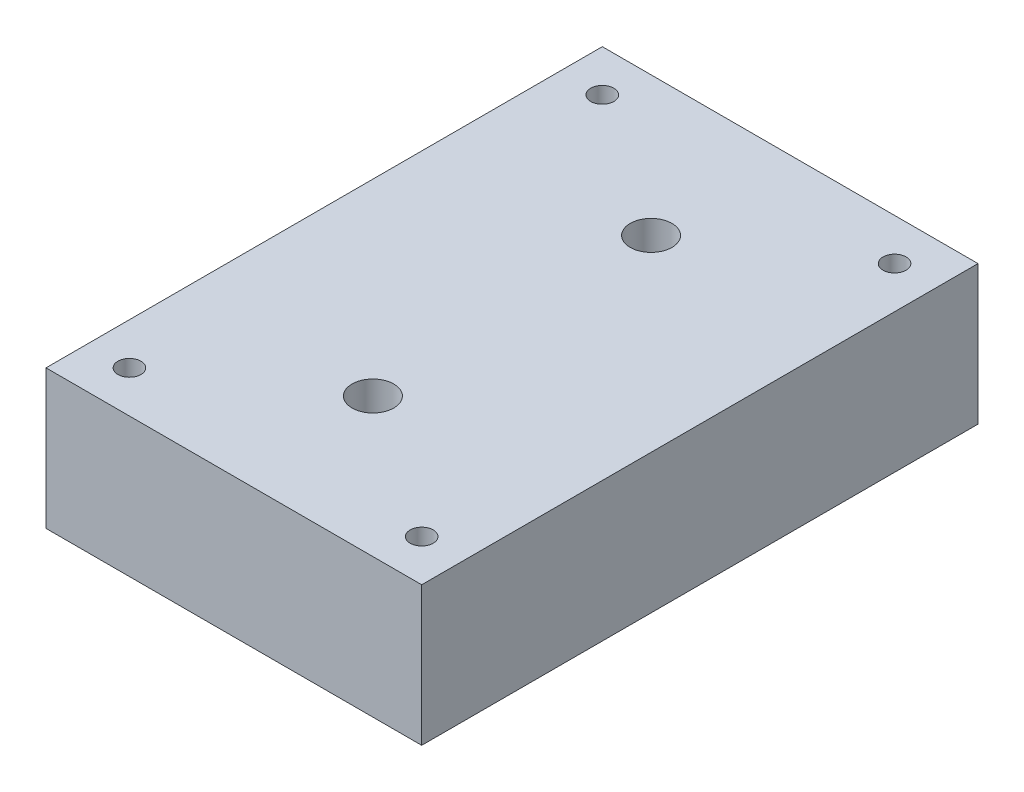
ISO-10303-21;
HEADER;
FILE_DESCRIPTION(('STEP AP214'),'2;1');
FILE_NAME('part.step','',(''),(''),'','','');
FILE_SCHEMA(('AUTOMOTIVE_DESIGN { 1 0 10303 214 1 1 1 1 }'));
ENDSEC;
DATA;
#1=APPLICATION_CONTEXT('core data for automotive mechanical design processes');
#2=APPLICATION_PROTOCOL_DEFINITION('international standard','automotive_design',2000,#1);
#3=PRODUCT_CONTEXT('',#1,'mechanical');
#4=PRODUCT('Part','Part','',(#3));
#5=PRODUCT_RELATED_PRODUCT_CATEGORY('part','',(#4));
#6=PRODUCT_DEFINITION_FORMATION('','',#4);
#7=PRODUCT_DEFINITION_CONTEXT('part definition',#1,'design');
#8=PRODUCT_DEFINITION('design','',#6,#7);
#9=PRODUCT_DEFINITION_SHAPE('','',#8);
#10=(LENGTH_UNIT() NAMED_UNIT(*) SI_UNIT(.MILLI.,.METRE.));
#11=(NAMED_UNIT(*) PLANE_ANGLE_UNIT() SI_UNIT($,.RADIAN.));
#12=(NAMED_UNIT(*) SI_UNIT($,.STERADIAN.) SOLID_ANGLE_UNIT());
#13=UNCERTAINTY_MEASURE_WITH_UNIT(LENGTH_MEASURE(1.E-05),#10,'distance_accuracy_value','');
#14=(GEOMETRIC_REPRESENTATION_CONTEXT(3) GLOBAL_UNCERTAINTY_ASSIGNED_CONTEXT((#13)) GLOBAL_UNIT_ASSIGNED_CONTEXT((#10,
#11,#12)) REPRESENTATION_CONTEXT('',''));
#15=CARTESIAN_POINT('',(0.,0.,0.));
#16=DIRECTION('',(0.,0.,1.));
#17=DIRECTION('',(1.,0.,0.));
#18=AXIS2_PLACEMENT_3D('',#15,#16,#17);
#19=CARTESIAN_POINT('',(67.5347222222222,-25.,200.));
#20=DIRECTION('',(0.,-1.,0.));
#21=DIRECTION('',(1.,0.,0.));
#22=AXIS2_PLACEMENT_3D('',#19,#20,#21);
#23=PLANE('',#22);
#24=CARTESIAN_POINT('',(0.,-25.,50.));
#25=DIRECTION('',(0.,-1.,0.));
#26=DIRECTION('',(0.,0.,-1.));
#27=AXIS2_PLACEMENT_3D('',#24,#25,#26);
#28=CIRCLE('',#27,7.5);
#29=CARTESIAN_POINT('',(0.,-25.,42.5));
#30=VERTEX_POINT('',#29);
#31=EDGE_CURVE('E124',#30,#30,#28,.T.);
#32=ORIENTED_EDGE('',*,*,#31,.F.);
#33=EDGE_LOOP('',(#32));
#34=FACE_BOUND('',#33,.T.);
#35=CARTESIAN_POINT('',(0.,-25.,150.));
#36=DIRECTION('',(0.,-1.,0.));
#37=DIRECTION('',(0.,0.,-1.));
#38=AXIS2_PLACEMENT_3D('',#35,#36,#37);
#39=CIRCLE('',#38,7.5);
#40=CARTESIAN_POINT('',(0.,-25.,142.5));
#41=VERTEX_POINT('',#40);
#42=EDGE_CURVE('E142',#41,#41,#39,.T.);
#43=ORIENTED_EDGE('',*,*,#42,.F.);
#44=EDGE_LOOP('',(#43));
#45=FACE_BOUND('',#44,.T.);
#46=DIRECTION('',(-1.,0.,0.));
#47=VECTOR('',#46,1.);
#48=CARTESIAN_POINT('',(67.5347222222222,-25.,0.));
#49=LINE('',#48,#47);
#50=CARTESIAN_POINT('',(67.5347222222222,-25.,0.));
#51=VERTEX_POINT('',#50);
#52=CARTESIAN_POINT('',(-67.5347222222222,-25.,0.));
#53=VERTEX_POINT('',#52);
#54=EDGE_CURVE('E160',#51,#53,#49,.T.);
#55=ORIENTED_EDGE('',*,*,#54,.F.);
#56=DIRECTION('',(0.,0.,-1.));
#57=VECTOR('',#56,1.);
#58=CARTESIAN_POINT('',(67.5347222222222,-25.,200.));
#59=LINE('',#58,#57);
#60=CARTESIAN_POINT('',(67.5347222222222,-25.,200.));
#61=VERTEX_POINT('',#60);
#62=EDGE_CURVE('E11',#61,#51,#59,.T.);
#63=ORIENTED_EDGE('',*,*,#62,.F.);
#64=DIRECTION('',(-1.,0.,0.));
#65=VECTOR('',#64,1.);
#66=CARTESIAN_POINT('',(67.5347222222222,-25.,200.));
#67=LINE('',#66,#65);
#68=CARTESIAN_POINT('',(-67.5347222222222,-25.,200.));
#69=VERTEX_POINT('',#68);
#70=EDGE_CURVE('E161',#61,#69,#67,.T.);
#71=ORIENTED_EDGE('',*,*,#70,.T.);
#72=DIRECTION('',(0.,0.,-1.));
#73=VECTOR('',#72,1.);
#74=CARTESIAN_POINT('',(-67.5347222222222,-25.,200.));
#75=LINE('',#74,#73);
#76=EDGE_CURVE('E38',#69,#53,#75,.T.);
#77=ORIENTED_EDGE('',*,*,#76,.T.);
#78=EDGE_LOOP('',(#55,#63,#71,#77));
#79=FACE_BOUND('',#78,.T.);
#80=ADVANCED_FACE('F35',(#34,#45,#79),#23,.T.);
#81=CARTESIAN_POINT('',(67.5347222222222,-25.,200.));
#82=DIRECTION('',(-1.,0.,0.));
#83=DIRECTION('',(0.,0.,1.));
#84=AXIS2_PLACEMENT_3D('',#81,#82,#83);
#85=PLANE('',#84);
#86=DIRECTION('',(0.,1.,0.));
#87=VECTOR('',#86,1.);
#88=CARTESIAN_POINT('',(67.5347222222222,-25.,0.));
#89=LINE('',#88,#87);
#90=CARTESIAN_POINT('',(67.5347222222222,25.,0.));
#91=VERTEX_POINT('',#90);
#92=EDGE_CURVE('E69',#51,#91,#89,.T.);
#93=ORIENTED_EDGE('',*,*,#92,.T.);
#94=DIRECTION('',(0.,0.,-1.));
#95=VECTOR('',#94,1.);
#96=CARTESIAN_POINT('',(67.5347222222222,25.,200.));
#97=LINE('',#96,#95);
#98=CARTESIAN_POINT('',(67.5347222222222,25.,200.));
#99=VERTEX_POINT('',#98);
#100=EDGE_CURVE('E44',#99,#91,#97,.T.);
#101=ORIENTED_EDGE('',*,*,#100,.F.);
#102=DIRECTION('',(0.,1.,0.));
#103=VECTOR('',#102,1.);
#104=CARTESIAN_POINT('',(67.5347222222222,-25.,200.));
#105=LINE('',#104,#103);
#106=EDGE_CURVE('E167',#61,#99,#105,.T.);
#107=ORIENTED_EDGE('',*,*,#106,.F.);
#108=ORIENTED_EDGE('',*,*,#62,.T.);
#109=EDGE_LOOP('',(#93,#101,#107,#108));
#110=FACE_BOUND('',#109,.T.);
#111=ADVANCED_FACE('F188',(#110),#85,.F.);
#112=CARTESIAN_POINT('',(67.5347222222222,25.,200.));
#113=DIRECTION('',(0.,-1.,0.));
#114=DIRECTION('',(1.,0.,0.));
#115=AXIS2_PLACEMENT_3D('',#112,#113,#114);
#116=PLANE('',#115);
#117=CARTESIAN_POINT('',(-52.5347222222222,25.,15.));
#118=DIRECTION('',(0.,1.,0.));
#119=DIRECTION('',(0.,0.,1.));
#120=AXIS2_PLACEMENT_3D('',#117,#118,#119);
#121=CIRCLE('',#120,4.14999999999999);
#122=CARTESIAN_POINT('',(-52.5347222222222,25.,19.15));
#123=VERTEX_POINT('',#122);
#124=EDGE_CURVE('E102',#123,#123,#121,.T.);
#125=ORIENTED_EDGE('',*,*,#124,.F.);
#126=EDGE_LOOP('',(#125));
#127=FACE_BOUND('',#126,.T.);
#128=CARTESIAN_POINT('',(52.5347222222222,25.,15.));
#129=DIRECTION('',(0.,1.,0.));
#130=DIRECTION('',(0.,0.,1.));
#131=AXIS2_PLACEMENT_3D('',#128,#129,#130);
#132=CIRCLE('',#131,4.14999999999999);
#133=CARTESIAN_POINT('',(52.5347222222222,25.,19.15));
#134=VERTEX_POINT('',#133);
#135=EDGE_CURVE('E101',#134,#134,#132,.T.);
#136=ORIENTED_EDGE('',*,*,#135,.F.);
#137=EDGE_LOOP('',(#136));
#138=FACE_BOUND('',#137,.T.);
#139=CARTESIAN_POINT('',(52.5347222222222,25.,185.));
#140=DIRECTION('',(0.,1.,0.));
#141=DIRECTION('',(0.,0.,1.));
#142=AXIS2_PLACEMENT_3D('',#139,#140,#141);
#143=CIRCLE('',#142,4.14999999999999);
#144=CARTESIAN_POINT('',(52.5347222222222,25.,189.15));
#145=VERTEX_POINT('',#144);
#146=EDGE_CURVE('E112',#145,#145,#143,.T.);
#147=ORIENTED_EDGE('',*,*,#146,.F.);
#148=EDGE_LOOP('',(#147));
#149=FACE_BOUND('',#148,.T.);
#150=CARTESIAN_POINT('',(-52.5347222222222,25.,185.));
#151=DIRECTION('',(0.,1.,0.));
#152=DIRECTION('',(0.,0.,1.));
#153=AXIS2_PLACEMENT_3D('',#150,#151,#152);
#154=CIRCLE('',#153,4.14999999999999);
#155=CARTESIAN_POINT('',(-52.5347222222222,25.,189.15));
#156=VERTEX_POINT('',#155);
#157=EDGE_CURVE('E118',#156,#156,#154,.T.);
#158=ORIENTED_EDGE('',*,*,#157,.F.);
#159=EDGE_LOOP('',(#158));
#160=FACE_BOUND('',#159,.T.);
#161=CARTESIAN_POINT('',(0.,25.,50.));
#162=DIRECTION('',(0.,1.,0.));
#163=DIRECTION('',(0.,0.,1.));
#164=AXIS2_PLACEMENT_3D('',#161,#162,#163);
#165=CIRCLE('',#164,7.50000000000002);
#166=CARTESIAN_POINT('',(0.,25.,57.5));
#167=VERTEX_POINT('',#166);
#168=EDGE_CURVE('E133',#167,#167,#165,.T.);
#169=ORIENTED_EDGE('',*,*,#168,.F.);
#170=EDGE_LOOP('',(#169));
#171=FACE_BOUND('',#170,.T.);
#172=CARTESIAN_POINT('',(0.,25.,150.));
#173=DIRECTION('',(0.,1.,0.));
#174=DIRECTION('',(0.,0.,1.));
#175=AXIS2_PLACEMENT_3D('',#172,#173,#174);
#176=CIRCLE('',#175,7.50000000000002);
#177=CARTESIAN_POINT('',(0.,25.,157.5));
#178=VERTEX_POINT('',#177);
#179=EDGE_CURVE('E151',#178,#178,#176,.T.);
#180=ORIENTED_EDGE('',*,*,#179,.F.);
#181=EDGE_LOOP('',(#180));
#182=FACE_BOUND('',#181,.T.);
#183=DIRECTION('',(-1.,0.,0.));
#184=VECTOR('',#183,1.);
#185=CARTESIAN_POINT('',(67.5347222222222,25.,0.));
#186=LINE('',#185,#184);
#187=CARTESIAN_POINT('',(-67.5347222222222,25.,0.));
#188=VERTEX_POINT('',#187);
#189=EDGE_CURVE('E174',#91,#188,#186,.T.);
#190=ORIENTED_EDGE('',*,*,#189,.T.);
#191=DIRECTION('',(0.,0.,-1.));
#192=VECTOR('',#191,1.);
#193=CARTESIAN_POINT('',(-67.5347222222222,25.,200.));
#194=LINE('',#193,#192);
#195=CARTESIAN_POINT('',(-67.5347222222222,25.,200.));
#196=VERTEX_POINT('',#195);
#197=EDGE_CURVE('E178',#196,#188,#194,.T.);
#198=ORIENTED_EDGE('',*,*,#197,.F.);
#199=DIRECTION('',(-1.,0.,0.));
#200=VECTOR('',#199,1.);
#201=CARTESIAN_POINT('',(67.5347222222222,25.,200.));
#202=LINE('',#201,#200);
#203=EDGE_CURVE('E165',#99,#196,#202,.T.);
#204=ORIENTED_EDGE('',*,*,#203,.F.);
#205=ORIENTED_EDGE('',*,*,#100,.T.);
#206=EDGE_LOOP('',(#190,#198,#204,#205));
#207=FACE_BOUND('',#206,.T.);
#208=ADVANCED_FACE('F186',(#127,#138,#149,#160,#171,#182,#207),#116,.F.);
#209=CARTESIAN_POINT('',(-67.5347222222222,-25.,200.));
#210=DIRECTION('',(-1.,0.,0.));
#211=DIRECTION('',(0.,0.,1.));
#212=AXIS2_PLACEMENT_3D('',#209,#210,#211);
#213=PLANE('',#212);
#214=DIRECTION('',(0.,1.,0.));
#215=VECTOR('',#214,1.);
#216=CARTESIAN_POINT('',(-67.5347222222222,-25.,0.));
#217=LINE('',#216,#215);
#218=EDGE_CURVE('E171',#53,#188,#217,.T.);
#219=ORIENTED_EDGE('',*,*,#218,.F.);
#220=ORIENTED_EDGE('',*,*,#76,.F.);
#221=DIRECTION('',(0.,1.,0.));
#222=VECTOR('',#221,1.);
#223=CARTESIAN_POINT('',(-67.5347222222222,-25.,200.));
#224=LINE('',#223,#222);
#225=EDGE_CURVE('E163',#69,#196,#224,.T.);
#226=ORIENTED_EDGE('',*,*,#225,.T.);
#227=ORIENTED_EDGE('',*,*,#197,.T.);
#228=EDGE_LOOP('',(#219,#220,#226,#227));
#229=FACE_BOUND('',#228,.T.);
#230=ADVANCED_FACE('F181',(#229),#213,.T.);
#231=CARTESIAN_POINT('',(0.,0.,200.));
#232=DIRECTION('',(0.,0.,-1.));
#233=DIRECTION('',(-1.,0.,0.));
#234=AXIS2_PLACEMENT_3D('',#231,#232,#233);
#235=PLANE('',#234);
#236=ORIENTED_EDGE('',*,*,#70,.F.);
#237=ORIENTED_EDGE('',*,*,#106,.T.);
#238=ORIENTED_EDGE('',*,*,#203,.T.);
#239=ORIENTED_EDGE('',*,*,#225,.F.);
#240=EDGE_LOOP('',(#236,#237,#238,#239));
#241=FACE_BOUND('',#240,.T.);
#242=ADVANCED_FACE('F190',(#241),#235,.F.);
#243=CARTESIAN_POINT('',(0.,0.,0.));
#244=DIRECTION('',(0.,0.,-1.));
#245=DIRECTION('',(-1.,0.,0.));
#246=AXIS2_PLACEMENT_3D('',#243,#244,#245);
#247=PLANE('',#246);
#248=ORIENTED_EDGE('',*,*,#54,.T.);
#249=ORIENTED_EDGE('',*,*,#218,.T.);
#250=ORIENTED_EDGE('',*,*,#189,.F.);
#251=ORIENTED_EDGE('',*,*,#92,.F.);
#252=EDGE_LOOP('',(#248,#249,#250,#251));
#253=FACE_BOUND('',#252,.T.);
#254=ADVANCED_FACE('F184',(#253),#247,.T.);
#255=CARTESIAN_POINT('',(0.,25.,150.));
#256=DIRECTION('',(0.,1.,0.));
#257=DIRECTION('',(0.,0.,1.));
#258=AXIS2_PLACEMENT_3D('',#255,#256,#257);
#259=CYLINDRICAL_SURFACE('',#258,4.49999999999999);
#260=CARTESIAN_POINT('',(0.,-18.5,150.));
#261=DIRECTION('',(0.,-1.,0.));
#262=DIRECTION('',(0.,0.,-1.));
#263=AXIS2_PLACEMENT_3D('',#260,#261,#262);
#264=CIRCLE('',#263,4.50000000000001);
#265=CARTESIAN_POINT('',(0.,-18.5,145.5));
#266=VERTEX_POINT('',#265);
#267=EDGE_CURVE('E148',#266,#266,#264,.T.);
#268=ORIENTED_EDGE('',*,*,#267,.T.);
#269=EDGE_LOOP('',(#268));
#270=FACE_BOUND('',#269,.T.);
#271=CARTESIAN_POINT('',(0.,-9.5,150.));
#272=DIRECTION('',(0.,1.,0.));
#273=DIRECTION('',(0.,0.,1.));
#274=AXIS2_PLACEMENT_3D('',#271,#272,#273);
#275=CIRCLE('',#274,4.49999999999999);
#276=CARTESIAN_POINT('',(0.,-9.5,154.5));
#277=VERTEX_POINT('',#276);
#278=EDGE_CURVE('E157',#277,#277,#275,.T.);
#279=ORIENTED_EDGE('',*,*,#278,.T.);
#280=EDGE_LOOP('',(#279));
#281=FACE_BOUND('',#280,.T.);
#282=ADVANCED_FACE('F197',(#270,#281),#259,.F.);
#283=CARTESIAN_POINT('',(4.5,-9.5,150.));
#284=DIRECTION('',(0.,-1.,0.));
#285=DIRECTION('',(0.,0.,-1.));
#286=AXIS2_PLACEMENT_3D('',#283,#284,#285);
#287=PLANE('',#286);
#288=ORIENTED_EDGE('',*,*,#278,.F.);
#289=EDGE_LOOP('',(#288));
#290=FACE_BOUND('',#289,.T.);
#291=CARTESIAN_POINT('',(0.,-9.5,150.));
#292=DIRECTION('',(0.,1.,0.));
#293=DIRECTION('',(0.,0.,1.));
#294=AXIS2_PLACEMENT_3D('',#291,#292,#293);
#295=CIRCLE('',#294,7.49999999999999);
#296=CARTESIAN_POINT('',(0.,-9.5,157.5));
#297=VERTEX_POINT('',#296);
#298=EDGE_CURVE('E154',#297,#297,#295,.T.);
#299=ORIENTED_EDGE('',*,*,#298,.T.);
#300=EDGE_LOOP('',(#299));
#301=FACE_BOUND('',#300,.T.);
#302=ADVANCED_FACE('F231',(#290,#301),#287,.F.);
#303=CARTESIAN_POINT('',(0.,25.,150.));
#304=DIRECTION('',(0.,1.,0.));
#305=DIRECTION('',(0.,0.,1.));
#306=AXIS2_PLACEMENT_3D('',#303,#304,#305);
#307=CYLINDRICAL_SURFACE('',#306,7.50000000000001);
#308=ORIENTED_EDGE('',*,*,#298,.F.);
#309=EDGE_LOOP('',(#308));
#310=FACE_BOUND('',#309,.T.);
#311=ORIENTED_EDGE('',*,*,#179,.T.);
#312=EDGE_LOOP('',(#311));
#313=FACE_BOUND('',#312,.T.);
#314=ADVANCED_FACE('F223',(#310,#313),#307,.F.);
#315=CARTESIAN_POINT('',(4.50000000000001,-18.5,150.));
#316=DIRECTION('',(0.,1.,0.));
#317=DIRECTION('',(0.,0.,1.));
#318=AXIS2_PLACEMENT_3D('',#315,#316,#317);
#319=PLANE('',#318);
#320=ORIENTED_EDGE('',*,*,#267,.F.);
#321=EDGE_LOOP('',(#320));
#322=FACE_BOUND('',#321,.T.);
#323=CARTESIAN_POINT('',(0.,-18.5,150.));
#324=DIRECTION('',(0.,-1.,0.));
#325=DIRECTION('',(0.,0.,-1.));
#326=AXIS2_PLACEMENT_3D('',#323,#324,#325);
#327=CIRCLE('',#326,7.49999999999999);
#328=CARTESIAN_POINT('',(0.,-18.5,142.5));
#329=VERTEX_POINT('',#328);
#330=EDGE_CURVE('E145',#329,#329,#327,.T.);
#331=ORIENTED_EDGE('',*,*,#330,.T.);
#332=EDGE_LOOP('',(#331));
#333=FACE_BOUND('',#332,.T.);
#334=ADVANCED_FACE('F213',(#322,#333),#319,.F.);
#335=CARTESIAN_POINT('',(0.,-25.,150.));
#336=DIRECTION('',(0.,-1.,0.));
#337=DIRECTION('',(0.,0.,-1.));
#338=AXIS2_PLACEMENT_3D('',#335,#336,#337);
#339=CYLINDRICAL_SURFACE('',#338,7.49999999999999);
#340=ORIENTED_EDGE('',*,*,#330,.F.);
#341=EDGE_LOOP('',(#340));
#342=FACE_BOUND('',#341,.T.);
#343=ORIENTED_EDGE('',*,*,#42,.T.);
#344=EDGE_LOOP('',(#343));
#345=FACE_BOUND('',#344,.T.);
#346=ADVANCED_FACE('F210',(#342,#345),#339,.F.);
#347=CARTESIAN_POINT('',(0.,25.,50.));
#348=DIRECTION('',(0.,1.,0.));
#349=DIRECTION('',(0.,0.,1.));
#350=AXIS2_PLACEMENT_3D('',#347,#348,#349);
#351=CYLINDRICAL_SURFACE('',#350,4.49999999999999);
#352=CARTESIAN_POINT('',(0.,-18.5,50.));
#353=DIRECTION('',(0.,-1.,0.));
#354=DIRECTION('',(0.,0.,-1.));
#355=AXIS2_PLACEMENT_3D('',#352,#353,#354);
#356=CIRCLE('',#355,4.50000000000001);
#357=CARTESIAN_POINT('',(0.,-18.5,45.5));
#358=VERTEX_POINT('',#357);
#359=EDGE_CURVE('E130',#358,#358,#356,.T.);
#360=ORIENTED_EDGE('',*,*,#359,.T.);
#361=EDGE_LOOP('',(#360));
#362=FACE_BOUND('',#361,.T.);
#363=CARTESIAN_POINT('',(0.,-9.5,50.));
#364=DIRECTION('',(0.,1.,0.));
#365=DIRECTION('',(0.,0.,1.));
#366=AXIS2_PLACEMENT_3D('',#363,#364,#365);
#367=CIRCLE('',#366,4.49999999999999);
#368=CARTESIAN_POINT('',(0.,-9.5,54.5));
#369=VERTEX_POINT('',#368);
#370=EDGE_CURVE('E139',#369,#369,#367,.T.);
#371=ORIENTED_EDGE('',*,*,#370,.T.);
#372=EDGE_LOOP('',(#371));
#373=FACE_BOUND('',#372,.T.);
#374=ADVANCED_FACE('F212',(#362,#373),#351,.F.);
#375=CARTESIAN_POINT('',(4.5,-9.5,50.));
#376=DIRECTION('',(0.,-1.,0.));
#377=DIRECTION('',(0.,0.,-1.));
#378=AXIS2_PLACEMENT_3D('',#375,#376,#377);
#379=PLANE('',#378);
#380=ORIENTED_EDGE('',*,*,#370,.F.);
#381=EDGE_LOOP('',(#380));
#382=FACE_BOUND('',#381,.T.);
#383=CARTESIAN_POINT('',(0.,-9.5,50.));
#384=DIRECTION('',(0.,1.,0.));
#385=DIRECTION('',(0.,0.,1.));
#386=AXIS2_PLACEMENT_3D('',#383,#384,#385);
#387=CIRCLE('',#386,7.49999999999999);
#388=CARTESIAN_POINT('',(0.,-9.5,57.5));
#389=VERTEX_POINT('',#388);
#390=EDGE_CURVE('E136',#389,#389,#387,.T.);
#391=ORIENTED_EDGE('',*,*,#390,.T.);
#392=EDGE_LOOP('',(#391));
#393=FACE_BOUND('',#392,.T.);
#394=ADVANCED_FACE('F220',(#382,#393),#379,.F.);
#395=CARTESIAN_POINT('',(0.,25.,50.));
#396=DIRECTION('',(0.,1.,0.));
#397=DIRECTION('',(0.,0.,1.));
#398=AXIS2_PLACEMENT_3D('',#395,#396,#397);
#399=CYLINDRICAL_SURFACE('',#398,7.50000000000001);
#400=ORIENTED_EDGE('',*,*,#390,.F.);
#401=EDGE_LOOP('',(#400));
#402=FACE_BOUND('',#401,.T.);
#403=ORIENTED_EDGE('',*,*,#168,.T.);
#404=EDGE_LOOP('',(#403));
#405=FACE_BOUND('',#404,.T.);
#406=ADVANCED_FACE('F262',(#402,#405),#399,.F.);
#407=CARTESIAN_POINT('',(4.50000000000001,-18.5,50.));
#408=DIRECTION('',(0.,1.,0.));
#409=DIRECTION('',(0.,0.,1.));
#410=AXIS2_PLACEMENT_3D('',#407,#408,#409);
#411=PLANE('',#410);
#412=ORIENTED_EDGE('',*,*,#359,.F.);
#413=EDGE_LOOP('',(#412));
#414=FACE_BOUND('',#413,.T.);
#415=CARTESIAN_POINT('',(0.,-18.5,50.));
#416=DIRECTION('',(0.,-1.,0.));
#417=DIRECTION('',(0.,0.,-1.));
#418=AXIS2_PLACEMENT_3D('',#415,#416,#417);
#419=CIRCLE('',#418,7.49999999999999);
#420=CARTESIAN_POINT('',(0.,-18.5,42.5));
#421=VERTEX_POINT('',#420);
#422=EDGE_CURVE('E127',#421,#421,#419,.T.);
#423=ORIENTED_EDGE('',*,*,#422,.T.);
#424=EDGE_LOOP('',(#423));
#425=FACE_BOUND('',#424,.T.);
#426=ADVANCED_FACE('F264',(#414,#425),#411,.F.);
#427=CARTESIAN_POINT('',(0.,-25.,50.));
#428=DIRECTION('',(0.,-1.,0.));
#429=DIRECTION('',(0.,0.,-1.));
#430=AXIS2_PLACEMENT_3D('',#427,#428,#429);
#431=CYLINDRICAL_SURFACE('',#430,7.49999999999999);
#432=ORIENTED_EDGE('',*,*,#422,.F.);
#433=EDGE_LOOP('',(#432));
#434=FACE_BOUND('',#433,.T.);
#435=ORIENTED_EDGE('',*,*,#31,.T.);
#436=EDGE_LOOP('',(#435));
#437=FACE_BOUND('',#436,.T.);
#438=ADVANCED_FACE('F271',(#434,#437),#431,.F.);
#439=CARTESIAN_POINT('',(-52.5347222222222,-5.,185.));
#440=DIRECTION('',(0.,1.,0.));
#441=DIRECTION('',(0.,0.,1.));
#442=AXIS2_PLACEMENT_3D('',#439,#440,#441);
#443=CONICAL_SURFACE('',#442,4.14999999999999,1.02974425867665);
#444=CARTESIAN_POINT('',(-52.5347222222222,-7.49357156896437,185.));
#445=VERTEX_POINT('',#444);
#446=VERTEX_LOOP('',#445);
#447=FACE_BOUND('',#446,.T.);
#448=CARTESIAN_POINT('',(-52.5347222222222,-5.,185.));
#449=DIRECTION('',(0.,1.,0.));
#450=DIRECTION('',(0.,0.,1.));
#451=AXIS2_PLACEMENT_3D('',#448,#449,#450);
#452=CIRCLE('',#451,4.14999999999999);
#453=CARTESIAN_POINT('',(-52.5347222222222,-5.,189.15));
#454=VERTEX_POINT('',#453);
#455=EDGE_CURVE('E121',#454,#454,#452,.T.);
#456=ORIENTED_EDGE('',*,*,#455,.T.);
#457=EDGE_LOOP('',(#456));
#458=FACE_BOUND('',#457,.T.);
#459=ADVANCED_FACE('F279',(#447,#458),#443,.F.);
#460=CARTESIAN_POINT('',(-52.5347222222222,25.,185.));
#461=DIRECTION('',(0.,1.,0.));
#462=DIRECTION('',(0.,0.,1.));
#463=AXIS2_PLACEMENT_3D('',#460,#461,#462);
#464=CYLINDRICAL_SURFACE('',#463,4.14999999999999);
#465=ORIENTED_EDGE('',*,*,#455,.F.);
#466=EDGE_LOOP('',(#465));
#467=FACE_BOUND('',#466,.T.);
#468=ORIENTED_EDGE('',*,*,#157,.T.);
#469=EDGE_LOOP('',(#468));
#470=FACE_BOUND('',#469,.T.);
#471=ADVANCED_FACE('F283',(#467,#470),#464,.F.);
#472=CARTESIAN_POINT('',(52.5347222222222,-5.,185.));
#473=DIRECTION('',(0.,1.,0.));
#474=DIRECTION('',(0.,0.,1.));
#475=AXIS2_PLACEMENT_3D('',#472,#473,#474);
#476=CONICAL_SURFACE('',#475,4.14999999999999,1.02974425867665);
#477=CARTESIAN_POINT('',(52.5347222222222,-7.49357156896437,185.));
#478=VERTEX_POINT('',#477);
#479=VERTEX_LOOP('',#478);
#480=FACE_BOUND('',#479,.T.);
#481=CARTESIAN_POINT('',(52.5347222222222,-5.,185.));
#482=DIRECTION('',(0.,1.,0.));
#483=DIRECTION('',(0.,0.,1.));
#484=AXIS2_PLACEMENT_3D('',#481,#482,#483);
#485=CIRCLE('',#484,4.14999999999999);
#486=CARTESIAN_POINT('',(52.5347222222222,-5.,189.15));
#487=VERTEX_POINT('',#486);
#488=EDGE_CURVE('E115',#487,#487,#485,.T.);
#489=ORIENTED_EDGE('',*,*,#488,.T.);
#490=EDGE_LOOP('',(#489));
#491=FACE_BOUND('',#490,.T.);
#492=ADVANCED_FACE('F287',(#480,#491),#476,.F.);
#493=CARTESIAN_POINT('',(52.5347222222222,25.,185.));
#494=DIRECTION('',(0.,1.,0.));
#495=DIRECTION('',(0.,0.,1.));
#496=AXIS2_PLACEMENT_3D('',#493,#494,#495);
#497=CYLINDRICAL_SURFACE('',#496,4.14999999999999);
#498=ORIENTED_EDGE('',*,*,#488,.F.);
#499=EDGE_LOOP('',(#498));
#500=FACE_BOUND('',#499,.T.);
#501=ORIENTED_EDGE('',*,*,#146,.T.);
#502=EDGE_LOOP('',(#501));
#503=FACE_BOUND('',#502,.T.);
#504=ADVANCED_FACE('F291',(#500,#503),#497,.F.);
#505=CARTESIAN_POINT('',(52.5347222222222,-5.,15.));
#506=DIRECTION('',(0.,1.,0.));
#507=DIRECTION('',(0.,0.,1.));
#508=AXIS2_PLACEMENT_3D('',#505,#506,#507);
#509=CONICAL_SURFACE('',#508,4.14999999999999,1.02974425867665);
#510=CARTESIAN_POINT('',(52.5347222222222,-7.49357156896437,15.));
#511=VERTEX_POINT('',#510);
#512=VERTEX_LOOP('',#511);
#513=FACE_BOUND('',#512,.T.);
#514=CARTESIAN_POINT('',(52.5347222222222,-5.,15.));
#515=DIRECTION('',(0.,1.,0.));
#516=DIRECTION('',(0.,0.,1.));
#517=AXIS2_PLACEMENT_3D('',#514,#515,#516);
#518=CIRCLE('',#517,4.14999999999999);
#519=CARTESIAN_POINT('',(52.5347222222222,-5.,19.15));
#520=VERTEX_POINT('',#519);
#521=EDGE_CURVE('E105',#520,#520,#518,.T.);
#522=ORIENTED_EDGE('',*,*,#521,.T.);
#523=EDGE_LOOP('',(#522));
#524=FACE_BOUND('',#523,.T.);
#525=ADVANCED_FACE('F295',(#513,#524),#509,.F.);
#526=CARTESIAN_POINT('',(52.5347222222222,25.,15.));
#527=DIRECTION('',(0.,1.,0.));
#528=DIRECTION('',(0.,0.,1.));
#529=AXIS2_PLACEMENT_3D('',#526,#527,#528);
#530=CYLINDRICAL_SURFACE('',#529,4.14999999999999);
#531=ORIENTED_EDGE('',*,*,#521,.F.);
#532=EDGE_LOOP('',(#531));
#533=FACE_BOUND('',#532,.T.);
#534=ORIENTED_EDGE('',*,*,#135,.T.);
#535=EDGE_LOOP('',(#534));
#536=FACE_BOUND('',#535,.T.);
#537=ADVANCED_FACE('F95',(#533,#536),#530,.F.);
#538=CARTESIAN_POINT('',(-52.5347222222222,-5.,15.));
#539=DIRECTION('',(0.,1.,0.));
#540=DIRECTION('',(0.,0.,1.));
#541=AXIS2_PLACEMENT_3D('',#538,#539,#540);
#542=CONICAL_SURFACE('',#541,4.14999999999999,1.02974425867665);
#543=CARTESIAN_POINT('',(-52.5347222222222,-7.49357156896437,15.));
#544=VERTEX_POINT('',#543);
#545=VERTEX_LOOP('',#544);
#546=FACE_BOUND('',#545,.T.);
#547=CARTESIAN_POINT('',(-52.5347222222222,-5.,15.));
#548=DIRECTION('',(0.,1.,0.));
#549=DIRECTION('',(0.,0.,1.));
#550=AXIS2_PLACEMENT_3D('',#547,#548,#549);
#551=CIRCLE('',#550,4.14999999999999);
#552=CARTESIAN_POINT('',(-52.5347222222222,-5.,19.15));
#553=VERTEX_POINT('',#552);
#554=EDGE_CURVE('E99',#553,#553,#551,.T.);
#555=ORIENTED_EDGE('',*,*,#554,.T.);
#556=EDGE_LOOP('',(#555));
#557=FACE_BOUND('',#556,.T.);
#558=ADVANCED_FACE('F91',(#546,#557),#542,.F.);
#559=CARTESIAN_POINT('',(-52.5347222222222,25.,15.));
#560=DIRECTION('',(0.,1.,0.));
#561=DIRECTION('',(0.,0.,1.));
#562=AXIS2_PLACEMENT_3D('',#559,#560,#561);
#563=CYLINDRICAL_SURFACE('',#562,4.14999999999999);
#564=ORIENTED_EDGE('',*,*,#554,.F.);
#565=EDGE_LOOP('',(#564));
#566=FACE_BOUND('',#565,.T.);
#567=ORIENTED_EDGE('',*,*,#124,.T.);
#568=EDGE_LOOP('',(#567));
#569=FACE_BOUND('',#568,.T.);
#570=ADVANCED_FACE('F94',(#566,#569),#563,.F.);
#571=CLOSED_SHELL('',(#80,#111,#208,#230,#242,#254,#282,#302,#314,#334,#346,#374,#394,#406,#426,
#438,#459,#471,#492,#504,#525,#537,#558,#570));
#572=MANIFOLD_SOLID_BREP('B2',#571);
#573=ADVANCED_BREP_SHAPE_REPRESENTATION('',(#18,#572),#14);
#574=SHAPE_DEFINITION_REPRESENTATION(#9,#573);
ENDSEC;
END-ISO-10303-21;
